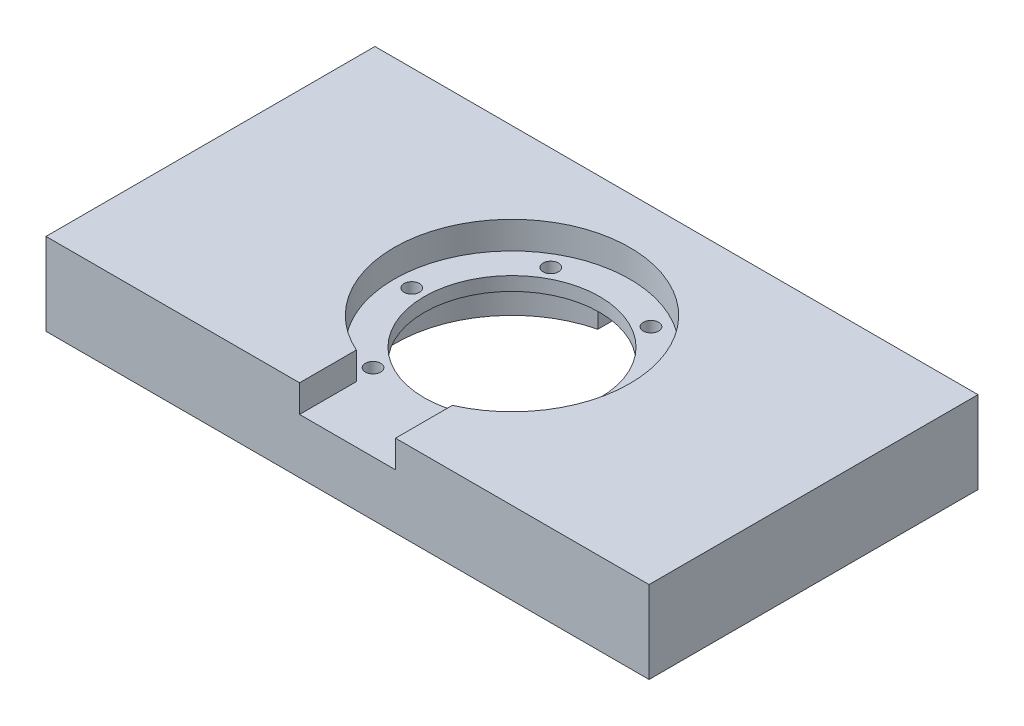
ISO-10303-21;
HEADER;
FILE_DESCRIPTION(('STEP AP214'),'2;1');
FILE_NAME('part.step','',(''),(''),'','','');
FILE_SCHEMA(('AUTOMOTIVE_DESIGN { 1 0 10303 214 1 1 1 1 }'));
ENDSEC;
DATA;
#1=APPLICATION_CONTEXT('core data for automotive mechanical design processes');
#2=APPLICATION_PROTOCOL_DEFINITION('international standard','automotive_design',2000,#1);
#3=PRODUCT_CONTEXT('',#1,'mechanical');
#4=PRODUCT('Part','Part','',(#3));
#5=PRODUCT_RELATED_PRODUCT_CATEGORY('part','',(#4));
#6=PRODUCT_DEFINITION_FORMATION('','',#4);
#7=PRODUCT_DEFINITION_CONTEXT('part definition',#1,'design');
#8=PRODUCT_DEFINITION('design','',#6,#7);
#9=PRODUCT_DEFINITION_SHAPE('','',#8);
#10=(LENGTH_UNIT() NAMED_UNIT(*) SI_UNIT(.MILLI.,.METRE.));
#11=(NAMED_UNIT(*) PLANE_ANGLE_UNIT() SI_UNIT($,.RADIAN.));
#12=(NAMED_UNIT(*) SI_UNIT($,.STERADIAN.) SOLID_ANGLE_UNIT());
#13=UNCERTAINTY_MEASURE_WITH_UNIT(LENGTH_MEASURE(1.E-05),#10,'distance_accuracy_value','');
#14=(GEOMETRIC_REPRESENTATION_CONTEXT(3) GLOBAL_UNCERTAINTY_ASSIGNED_CONTEXT((#13)) GLOBAL_UNIT_ASSIGNED_CONTEXT((#10,
#11,#12)) REPRESENTATION_CONTEXT('',''));
#15=CARTESIAN_POINT('',(0.,0.,0.));
#16=DIRECTION('',(0.,0.,1.));
#17=DIRECTION('',(1.,0.,0.));
#18=AXIS2_PLACEMENT_3D('',#15,#16,#17);
#19=CARTESIAN_POINT('',(18.1221367706661,-20.,32.2581487203663));
#20=DIRECTION('',(0.,1.,0.));
#21=DIRECTION('',(0.,0.,1.));
#22=AXIS2_PLACEMENT_3D('',#19,#20,#21);
#23=CYLINDRICAL_SURFACE('',#22,2.8);
#24=CARTESIAN_POINT('',(18.1221367706661,0.,32.2581487203663));
#25=DIRECTION('',(0.,-1.,0.));
#26=DIRECTION('',(0.,0.,-1.));
#27=AXIS2_PLACEMENT_3D('',#24,#25,#26);
#28=CIRCLE('',#27,2.8);
#29=CARTESIAN_POINT('',(18.1221367706661,0.,29.4581487203663));
#30=VERTEX_POINT('',#29);
#31=EDGE_CURVE('E225',#30,#30,#28,.T.);
#32=ORIENTED_EDGE('',*,*,#31,.F.);
#33=EDGE_LOOP('',(#32));
#34=FACE_BOUND('',#33,.T.);
#35=CARTESIAN_POINT('',(18.1221367706661,-5.,32.2581487203663));
#36=DIRECTION('',(0.,-1.,0.));
#37=DIRECTION('',(0.,0.,-1.));
#38=AXIS2_PLACEMENT_3D('',#35,#36,#37);
#39=CIRCLE('',#38,2.8);
#40=CARTESIAN_POINT('',(18.1221367706661,-5.,29.4581487203663));
#41=VERTEX_POINT('',#40);
#42=EDGE_CURVE('E303',#41,#41,#39,.T.);
#43=ORIENTED_EDGE('',*,*,#42,.T.);
#44=EDGE_LOOP('',(#43));
#45=FACE_BOUND('',#44,.T.);
#46=ADVANCED_FACE('F47',(#34,#45),#23,.F.);
#47=CARTESIAN_POINT('',(36.9974446562268,-20.,0.434843545930153));
#48=DIRECTION('',(0.,1.,0.));
#49=DIRECTION('',(0.,0.,1.));
#50=AXIS2_PLACEMENT_3D('',#47,#48,#49);
#51=CYLINDRICAL_SURFACE('',#50,2.8);
#52=CARTESIAN_POINT('',(36.9974446562268,0.,0.434843545930153));
#53=DIRECTION('',(0.,-1.,0.));
#54=DIRECTION('',(0.,0.,-1.));
#55=AXIS2_PLACEMENT_3D('',#52,#53,#54);
#56=CIRCLE('',#55,2.8);
#57=CARTESIAN_POINT('',(36.9974446562268,0.,-2.36515645406985));
#58=VERTEX_POINT('',#57);
#59=EDGE_CURVE('E221',#58,#58,#56,.T.);
#60=ORIENTED_EDGE('',*,*,#59,.F.);
#61=EDGE_LOOP('',(#60));
#62=FACE_BOUND('',#61,.T.);
#63=CARTESIAN_POINT('',(36.9974446562268,-5.,0.434843545930153));
#64=DIRECTION('',(0.,-1.,0.));
#65=DIRECTION('',(0.,0.,-1.));
#66=AXIS2_PLACEMENT_3D('',#63,#64,#65);
#67=CIRCLE('',#66,2.8);
#68=CARTESIAN_POINT('',(36.9974446562268,-5.,-2.36515645406985));
#69=VERTEX_POINT('',#68);
#70=EDGE_CURVE('E309',#69,#69,#67,.T.);
#71=ORIENTED_EDGE('',*,*,#70,.T.);
#72=EDGE_LOOP('',(#71));
#73=FACE_BOUND('',#72,.T.);
#74=ADVANCED_FACE('F351',(#62,#73),#51,.F.);
#75=CARTESIAN_POINT('',(18.8753078855607,-20.,-31.8233051744363));
#76=DIRECTION('',(0.,1.,0.));
#77=DIRECTION('',(0.,0.,1.));
#78=AXIS2_PLACEMENT_3D('',#75,#76,#77);
#79=CYLINDRICAL_SURFACE('',#78,2.8);
#80=CARTESIAN_POINT('',(18.8753078855607,0.,-31.8233051744363));
#81=DIRECTION('',(0.,-1.,0.));
#82=DIRECTION('',(0.,0.,-1.));
#83=AXIS2_PLACEMENT_3D('',#80,#81,#82);
#84=CIRCLE('',#83,2.8);
#85=CARTESIAN_POINT('',(18.8753078855607,0.,-34.6233051744363));
#86=VERTEX_POINT('',#85);
#87=EDGE_CURVE('E217',#86,#86,#84,.T.);
#88=ORIENTED_EDGE('',*,*,#87,.F.);
#89=EDGE_LOOP('',(#88));
#90=FACE_BOUND('',#89,.T.);
#91=CARTESIAN_POINT('',(18.8753078855607,-5.,-31.8233051744363));
#92=DIRECTION('',(0.,-1.,0.));
#93=DIRECTION('',(0.,0.,-1.));
#94=AXIS2_PLACEMENT_3D('',#91,#92,#93);
#95=CIRCLE('',#94,2.8);
#96=CARTESIAN_POINT('',(18.8753078855607,-5.,-34.6233051744363));
#97=VERTEX_POINT('',#96);
#98=EDGE_CURVE('E316',#97,#97,#95,.T.);
#99=ORIENTED_EDGE('',*,*,#98,.T.);
#100=EDGE_LOOP('',(#99));
#101=FACE_BOUND('',#100,.T.);
#102=ADVANCED_FACE('F358',(#90,#101),#79,.F.);
#103=CARTESIAN_POINT('',(-18.1221367706662,-20.,-32.2581487203665));
#104=DIRECTION('',(0.,1.,0.));
#105=DIRECTION('',(0.,0.,1.));
#106=AXIS2_PLACEMENT_3D('',#103,#104,#105);
#107=CYLINDRICAL_SURFACE('',#106,2.8);
#108=CARTESIAN_POINT('',(-18.1221367706662,0.,-32.2581487203665));
#109=DIRECTION('',(0.,-1.,0.));
#110=DIRECTION('',(0.,0.,-1.));
#111=AXIS2_PLACEMENT_3D('',#108,#109,#110);
#112=CIRCLE('',#111,2.8);
#113=CARTESIAN_POINT('',(-18.1221367706662,0.,-35.0581487203665));
#114=VERTEX_POINT('',#113);
#115=EDGE_CURVE('E213',#114,#114,#112,.T.);
#116=ORIENTED_EDGE('',*,*,#115,.F.);
#117=EDGE_LOOP('',(#116));
#118=FACE_BOUND('',#117,.T.);
#119=CARTESIAN_POINT('',(-18.1221367706662,-5.,-32.2581487203665));
#120=DIRECTION('',(0.,-1.,0.));
#121=DIRECTION('',(0.,0.,-1.));
#122=AXIS2_PLACEMENT_3D('',#119,#120,#121);
#123=CIRCLE('',#122,2.8);
#124=CARTESIAN_POINT('',(-18.1221367706662,-5.,-35.0581487203665));
#125=VERTEX_POINT('',#124);
#126=EDGE_CURVE('E320',#125,#125,#123,.T.);
#127=ORIENTED_EDGE('',*,*,#126,.T.);
#128=EDGE_LOOP('',(#127));
#129=FACE_BOUND('',#128,.T.);
#130=ADVANCED_FACE('F518',(#118,#129),#107,.F.);
#131=CARTESIAN_POINT('',(-36.9974446562269,-20.,-0.434843545930336));
#132=DIRECTION('',(0.,1.,0.));
#133=DIRECTION('',(0.,0.,1.));
#134=AXIS2_PLACEMENT_3D('',#131,#132,#133);
#135=CYLINDRICAL_SURFACE('',#134,2.8);
#136=CARTESIAN_POINT('',(-36.9974446562269,0.,-0.434843545930336));
#137=DIRECTION('',(0.,-1.,0.));
#138=DIRECTION('',(0.,0.,-1.));
#139=AXIS2_PLACEMENT_3D('',#136,#137,#138);
#140=CIRCLE('',#139,2.8);
#141=CARTESIAN_POINT('',(-36.9974446562269,0.,-3.23484354593033));
#142=VERTEX_POINT('',#141);
#143=EDGE_CURVE('E209',#142,#142,#140,.T.);
#144=ORIENTED_EDGE('',*,*,#143,.F.);
#145=EDGE_LOOP('',(#144));
#146=FACE_BOUND('',#145,.T.);
#147=CARTESIAN_POINT('',(-36.9974446562269,-5.,-0.434843545930336));
#148=DIRECTION('',(0.,-1.,0.));
#149=DIRECTION('',(0.,0.,-1.));
#150=AXIS2_PLACEMENT_3D('',#147,#148,#149);
#151=CIRCLE('',#150,2.8);
#152=CARTESIAN_POINT('',(-36.9974446562269,-5.,-3.23484354593033));
#153=VERTEX_POINT('',#152);
#154=EDGE_CURVE('E324',#153,#153,#151,.T.);
#155=ORIENTED_EDGE('',*,*,#154,.T.);
#156=EDGE_LOOP('',(#155));
#157=FACE_BOUND('',#156,.T.);
#158=ADVANCED_FACE('F526',(#146,#157),#135,.F.);
#159=CARTESIAN_POINT('',(-18.8753078855608,-20.,31.8233051744361));
#160=DIRECTION('',(0.,1.,0.));
#161=DIRECTION('',(0.,0.,1.));
#162=AXIS2_PLACEMENT_3D('',#159,#160,#161);
#163=CYLINDRICAL_SURFACE('',#162,2.8);
#164=CARTESIAN_POINT('',(-18.8753078855608,0.,31.8233051744361));
#165=DIRECTION('',(0.,-1.,0.));
#166=DIRECTION('',(0.,0.,-1.));
#167=AXIS2_PLACEMENT_3D('',#164,#165,#166);
#168=CIRCLE('',#167,2.8);
#169=CARTESIAN_POINT('',(-18.8753078855608,0.,29.0233051744361));
#170=VERTEX_POINT('',#169);
#171=EDGE_CURVE('E196',#170,#170,#168,.T.);
#172=ORIENTED_EDGE('',*,*,#171,.F.);
#173=EDGE_LOOP('',(#172));
#174=FACE_BOUND('',#173,.T.);
#175=CARTESIAN_POINT('',(-18.8753078855608,-5.,31.8233051744361));
#176=DIRECTION('',(0.,-1.,0.));
#177=DIRECTION('',(0.,0.,-1.));
#178=AXIS2_PLACEMENT_3D('',#175,#176,#177);
#179=CIRCLE('',#178,2.8);
#180=CARTESIAN_POINT('',(-18.8753078855608,-5.,29.0233051744361));
#181=VERTEX_POINT('',#180);
#182=EDGE_CURVE('E328',#181,#181,#179,.T.);
#183=ORIENTED_EDGE('',*,*,#182,.T.);
#184=EDGE_LOOP('',(#183));
#185=FACE_BOUND('',#184,.T.);
#186=ADVANCED_FACE('F535',(#174,#185),#163,.F.);
#187=CARTESIAN_POINT('',(0.,-20.,0.));
#188=DIRECTION('',(0.,1.,0.));
#189=DIRECTION('',(0.,0.,1.));
#190=AXIS2_PLACEMENT_3D('',#187,#188,#189);
#191=CYLINDRICAL_SURFACE('',#190,32.);
#192=CARTESIAN_POINT('',(0.,0.,0.));
#193=DIRECTION('',(0.,1.,0.));
#194=DIRECTION('',(0.,0.,1.));
#195=AXIS2_PLACEMENT_3D('',#192,#193,#194);
#196=CIRCLE('',#195,32.);
#197=CARTESIAN_POINT('',(0.,0.,32.));
#198=VERTEX_POINT('',#197);
#199=EDGE_CURVE('E164',#198,#198,#196,.T.);
#200=ORIENTED_EDGE('',*,*,#199,.T.);
#201=EDGE_LOOP('',(#200));
#202=FACE_BOUND('',#201,.T.);
#203=CARTESIAN_POINT('',(0.,-5.,0.));
#204=DIRECTION('',(0.,-1.,0.));
#205=DIRECTION('',(0.,0.,-1.));
#206=AXIS2_PLACEMENT_3D('',#203,#204,#205);
#207=CIRCLE('',#206,32.);
#208=CARTESIAN_POINT('',(0.,-5.,-32.));
#209=VERTEX_POINT('',#208);
#210=EDGE_CURVE('E51',#209,#209,#207,.F.);
#211=ORIENTED_EDGE('',*,*,#210,.F.);
#212=EDGE_LOOP('',(#211));
#213=FACE_BOUND('',#212,.T.);
#214=ADVANCED_FACE('F379',(#202,#213),#191,.F.);
#215=CARTESIAN_POINT('',(0.,10.,0.));
#216=DIRECTION('',(0.,1.,0.));
#217=DIRECTION('',(0.,0.,1.));
#218=AXIS2_PLACEMENT_3D('',#215,#216,#217);
#219=PLANE('',#218);
#220=DIRECTION('',(0.,0.,1.));
#221=VECTOR('',#220,1.);
#222=CARTESIAN_POINT('',(-17.5,10.,-60.001));
#223=LINE('',#222,#221);
#224=CARTESIAN_POINT('',(-17.5,10.,39.2778563569857));
#225=VERTEX_POINT('',#224);
#226=CARTESIAN_POINT('',(-17.5,10.,60.));
#227=VERTEX_POINT('',#226);
#228=EDGE_CURVE('E200',#225,#227,#223,.T.);
#229=ORIENTED_EDGE('',*,*,#228,.F.);
#230=CARTESIAN_POINT('',(0.,10.,0.));
#231=DIRECTION('',(0.,1.,0.));
#232=DIRECTION('',(0.,0.,1.));
#233=AXIS2_PLACEMENT_3D('',#230,#231,#232);
#234=CIRCLE('',#233,43.);
#235=CARTESIAN_POINT('',(17.5,10.,39.2778563569857));
#236=VERTEX_POINT('',#235);
#237=EDGE_CURVE('E246',#236,#225,#234,.T.);
#238=ORIENTED_EDGE('',*,*,#237,.F.);
#239=DIRECTION('',(0.,0.,1.));
#240=VECTOR('',#239,1.);
#241=CARTESIAN_POINT('',(17.5,10.,-60.001));
#242=LINE('',#241,#240);
#243=CARTESIAN_POINT('',(17.5,10.,60.));
#244=VERTEX_POINT('',#243);
#245=EDGE_CURVE('E193',#236,#244,#242,.T.);
#246=ORIENTED_EDGE('',*,*,#245,.T.);
#247=DIRECTION('',(1.,0.,0.));
#248=VECTOR('',#247,1.);
#249=CARTESIAN_POINT('',(110.,10.,60.));
#250=LINE('',#249,#248);
#251=CARTESIAN_POINT('',(110.,10.,60.));
#252=VERTEX_POINT('',#251);
#253=EDGE_CURVE('E256',#244,#252,#250,.T.);
#254=ORIENTED_EDGE('',*,*,#253,.T.);
#255=DIRECTION('',(0.,0.,-1.));
#256=VECTOR('',#255,1.);
#257=CARTESIAN_POINT('',(110.,10.,60.));
#258=LINE('',#257,#256);
#259=CARTESIAN_POINT('',(110.,10.,-60.));
#260=VERTEX_POINT('',#259);
#261=EDGE_CURVE('E261',#252,#260,#258,.T.);
#262=ORIENTED_EDGE('',*,*,#261,.T.);
#263=DIRECTION('',(-1.,0.,0.));
#264=VECTOR('',#263,1.);
#265=CARTESIAN_POINT('',(110.,10.,-60.));
#266=LINE('',#265,#264);
#267=CARTESIAN_POINT('',(-110.,10.,-60.));
#268=VERTEX_POINT('',#267);
#269=EDGE_CURVE('E264',#260,#268,#266,.T.);
#270=ORIENTED_EDGE('',*,*,#269,.T.);
#271=DIRECTION('',(0.,0.,1.));
#272=VECTOR('',#271,1.);
#273=CARTESIAN_POINT('',(-110.,10.,60.));
#274=LINE('',#273,#272);
#275=CARTESIAN_POINT('',(-110.,10.,60.));
#276=VERTEX_POINT('',#275);
#277=EDGE_CURVE('E250',#268,#276,#274,.T.);
#278=ORIENTED_EDGE('',*,*,#277,.T.);
#279=EDGE_CURVE('E257',#276,#227,#250,.T.);
#280=ORIENTED_EDGE('',*,*,#279,.T.);
#281=EDGE_LOOP('',(#229,#238,#246,#254,#262,#270,#278,#280));
#282=FACE_BOUND('',#281,.T.);
#283=ADVANCED_FACE('F376',(#282),#219,.T.);
#284=CARTESIAN_POINT('',(-110.,10.,60.));
#285=DIRECTION('',(1.,0.,0.));
#286=DIRECTION('',(0.,0.,-1.));
#287=AXIS2_PLACEMENT_3D('',#284,#285,#286);
#288=PLANE('',#287);
#289=DIRECTION('',(0.,-1.,0.));
#290=VECTOR('',#289,1.);
#291=CARTESIAN_POINT('',(-110.,10.,-60.));
#292=LINE('',#291,#290);
#293=CARTESIAN_POINT('',(-110.,-20.,-60.));
#294=VERTEX_POINT('',#293);
#295=EDGE_CURVE('E267',#268,#294,#292,.T.);
#296=ORIENTED_EDGE('',*,*,#295,.T.);
#297=DIRECTION('',(0.,0.,-1.));
#298=VECTOR('',#297,1.);
#299=CARTESIAN_POINT('',(-110.,-20.,60.));
#300=LINE('',#299,#298);
#301=CARTESIAN_POINT('',(-110.,-20.,60.));
#302=VERTEX_POINT('',#301);
#303=EDGE_CURVE('E229',#302,#294,#300,.T.);
#304=ORIENTED_EDGE('',*,*,#303,.F.);
#305=DIRECTION('',(0.,-1.,0.));
#306=VECTOR('',#305,1.);
#307=CARTESIAN_POINT('',(-110.,10.,60.));
#308=LINE('',#307,#306);
#309=EDGE_CURVE('E57',#276,#302,#308,.T.);
#310=ORIENTED_EDGE('',*,*,#309,.F.);
#311=ORIENTED_EDGE('',*,*,#277,.F.);
#312=EDGE_LOOP('',(#296,#304,#310,#311));
#313=FACE_BOUND('',#312,.T.);
#314=ADVANCED_FACE('F49',(#313),#288,.F.);
#315=CARTESIAN_POINT('',(110.,10.,60.));
#316=DIRECTION('',(0.,0.,-1.));
#317=DIRECTION('',(-1.,0.,0.));
#318=AXIS2_PLACEMENT_3D('',#315,#316,#317);
#319=PLANE('',#318);
#320=DIRECTION('',(1.,0.,0.));
#321=VECTOR('',#320,1.);
#322=CARTESIAN_POINT('',(-17.5,0.,60.));
#323=LINE('',#322,#321);
#324=CARTESIAN_POINT('',(-17.5,0.,60.));
#325=VERTEX_POINT('',#324);
#326=CARTESIAN_POINT('',(17.5,0.,60.));
#327=VERTEX_POINT('',#326);
#328=EDGE_CURVE('E190',#325,#327,#323,.T.);
#329=ORIENTED_EDGE('',*,*,#328,.F.);
#330=DIRECTION('',(0.,-1.,0.));
#331=VECTOR('',#330,1.);
#332=CARTESIAN_POINT('',(-17.5,0.,60.));
#333=LINE('',#332,#331);
#334=EDGE_CURVE('E186',#227,#325,#333,.T.);
#335=ORIENTED_EDGE('',*,*,#334,.F.);
#336=ORIENTED_EDGE('',*,*,#279,.F.);
#337=ORIENTED_EDGE('',*,*,#309,.T.);
#338=DIRECTION('',(-1.,0.,0.));
#339=VECTOR('',#338,1.);
#340=CARTESIAN_POINT('',(-110.,-20.,60.));
#341=LINE('',#340,#339);
#342=CARTESIAN_POINT('',(110.,-20.,60.));
#343=VERTEX_POINT('',#342);
#344=EDGE_CURVE('E241',#343,#302,#341,.T.);
#345=ORIENTED_EDGE('',*,*,#344,.F.);
#346=DIRECTION('',(0.,-1.,0.));
#347=VECTOR('',#346,1.);
#348=CARTESIAN_POINT('',(110.,10.,60.));
#349=LINE('',#348,#347);
#350=EDGE_CURVE('E274',#252,#343,#349,.T.);
#351=ORIENTED_EDGE('',*,*,#350,.F.);
#352=ORIENTED_EDGE('',*,*,#253,.F.);
#353=DIRECTION('',(0.,1.,0.));
#354=VECTOR('',#353,1.);
#355=CARTESIAN_POINT('',(17.5,0.,60.));
#356=LINE('',#355,#354);
#357=EDGE_CURVE('E183',#327,#244,#356,.T.);
#358=ORIENTED_EDGE('',*,*,#357,.F.);
#359=EDGE_LOOP('',(#329,#335,#336,#337,#345,#351,#352,#358));
#360=FACE_BOUND('',#359,.T.);
#361=ADVANCED_FACE('F282',(#360),#319,.F.);
#362=CARTESIAN_POINT('',(110.,10.,60.));
#363=DIRECTION('',(-1.,0.,0.));
#364=DIRECTION('',(0.,0.,1.));
#365=AXIS2_PLACEMENT_3D('',#362,#363,#364);
#366=PLANE('',#365);
#367=ORIENTED_EDGE('',*,*,#350,.T.);
#368=DIRECTION('',(0.,0.,1.));
#369=VECTOR('',#368,1.);
#370=CARTESIAN_POINT('',(110.,-20.,60.));
#371=LINE('',#370,#369);
#372=CARTESIAN_POINT('',(110.,-20.,-60.));
#373=VERTEX_POINT('',#372);
#374=EDGE_CURVE('E237',#373,#343,#371,.T.);
#375=ORIENTED_EDGE('',*,*,#374,.F.);
#376=DIRECTION('',(0.,-1.,0.));
#377=VECTOR('',#376,1.);
#378=CARTESIAN_POINT('',(110.,10.,-60.));
#379=LINE('',#378,#377);
#380=EDGE_CURVE('E270',#260,#373,#379,.T.);
#381=ORIENTED_EDGE('',*,*,#380,.F.);
#382=ORIENTED_EDGE('',*,*,#261,.F.);
#383=EDGE_LOOP('',(#367,#375,#381,#382));
#384=FACE_BOUND('',#383,.T.);
#385=ADVANCED_FACE('F382',(#384),#366,.F.);
#386=CARTESIAN_POINT('',(110.,10.,-60.));
#387=DIRECTION('',(0.,0.,1.));
#388=DIRECTION('',(1.,0.,0.));
#389=AXIS2_PLACEMENT_3D('',#386,#387,#388);
#390=PLANE('',#389);
#391=DIRECTION('',(1.,0.,0.));
#392=VECTOR('',#391,1.);
#393=CARTESIAN_POINT('',(9.99999999999999,-10.,-60.));
#394=LINE('',#393,#392);
#395=CARTESIAN_POINT('',(-10.,-10.,-60.));
#396=VERTEX_POINT('',#395);
#397=CARTESIAN_POINT('',(9.99999999999999,-10.,-60.));
#398=VERTEX_POINT('',#397);
#399=EDGE_CURVE('E299',#396,#398,#394,.T.);
#400=ORIENTED_EDGE('',*,*,#399,.F.);
#401=DIRECTION('',(0.,1.,0.));
#402=VECTOR('',#401,1.);
#403=CARTESIAN_POINT('',(-10.,-10.,-60.));
#404=LINE('',#403,#402);
#405=CARTESIAN_POINT('',(-10.,-20.,-60.));
#406=VERTEX_POINT('',#405);
#407=EDGE_CURVE('E297',#406,#396,#404,.T.);
#408=ORIENTED_EDGE('',*,*,#407,.F.);
#409=DIRECTION('',(1.,0.,0.));
#410=VECTOR('',#409,1.);
#411=CARTESIAN_POINT('',(-110.,-20.,-60.));
#412=LINE('',#411,#410);
#413=EDGE_CURVE('E234',#294,#406,#412,.T.);
#414=ORIENTED_EDGE('',*,*,#413,.F.);
#415=ORIENTED_EDGE('',*,*,#295,.F.);
#416=ORIENTED_EDGE('',*,*,#269,.F.);
#417=ORIENTED_EDGE('',*,*,#380,.T.);
#418=CARTESIAN_POINT('',(9.99999999999999,-20.,-60.));
#419=VERTEX_POINT('',#418);
#420=EDGE_CURVE('E233',#419,#373,#412,.T.);
#421=ORIENTED_EDGE('',*,*,#420,.F.);
#422=DIRECTION('',(0.,-1.,0.));
#423=VECTOR('',#422,1.);
#424=CARTESIAN_POINT('',(9.99999999999999,-10.,-60.));
#425=LINE('',#424,#423);
#426=EDGE_CURVE('E157',#398,#419,#425,.T.);
#427=ORIENTED_EDGE('',*,*,#426,.F.);
#428=EDGE_LOOP('',(#400,#408,#414,#415,#416,#417,#421,#427));
#429=FACE_BOUND('',#428,.T.);
#430=ADVANCED_FACE('F295',(#429),#390,.F.);
#431=CARTESIAN_POINT('',(0.,10.,0.));
#432=DIRECTION('',(0.,-1.,0.));
#433=DIRECTION('',(0.,0.,-1.));
#434=AXIS2_PLACEMENT_3D('',#431,#432,#433);
#435=CYLINDRICAL_SURFACE('',#434,43.);
#436=DIRECTION('',(0.,-1.,0.));
#437=VECTOR('',#436,1.);
#438=CARTESIAN_POINT('',(-17.5,10.,39.2778563569857));
#439=LINE('',#438,#437);
#440=CARTESIAN_POINT('',(-17.5,0.,39.2778563569857));
#441=VERTEX_POINT('',#440);
#442=EDGE_CURVE('E175',#225,#441,#439,.T.);
#443=ORIENTED_EDGE('',*,*,#442,.T.);
#444=CARTESIAN_POINT('',(0.,0.,0.));
#445=DIRECTION('',(0.,1.,0.));
#446=DIRECTION('',(0.,0.,1.));
#447=AXIS2_PLACEMENT_3D('',#444,#445,#446);
#448=CIRCLE('',#447,43.);
#449=CARTESIAN_POINT('',(17.5,0.,39.2778563569857));
#450=VERTEX_POINT('',#449);
#451=EDGE_CURVE('E245',#450,#441,#448,.T.);
#452=ORIENTED_EDGE('',*,*,#451,.F.);
#453=DIRECTION('',(0.,-1.,0.));
#454=VECTOR('',#453,1.);
#455=CARTESIAN_POINT('',(17.5,10.,39.2778563569857));
#456=LINE('',#455,#454);
#457=EDGE_CURVE('E179',#450,#236,#456,.F.);
#458=ORIENTED_EDGE('',*,*,#457,.T.);
#459=ORIENTED_EDGE('',*,*,#237,.T.);
#460=EDGE_LOOP('',(#443,#452,#458,#459));
#461=FACE_BOUND('',#460,.T.);
#462=ADVANCED_FACE('F371',(#461),#435,.F.);
#463=CARTESIAN_POINT('',(0.,0.,0.));
#464=DIRECTION('',(0.,-1.,0.));
#465=DIRECTION('',(0.,0.,-1.));
#466=AXIS2_PLACEMENT_3D('',#463,#464,#465);
#467=PLANE('',#466);
#468=ORIENTED_EDGE('',*,*,#199,.F.);
#469=EDGE_LOOP('',(#468));
#470=FACE_BOUND('',#469,.T.);
#471=ORIENTED_EDGE('',*,*,#171,.T.);
#472=EDGE_LOOP('',(#471));
#473=FACE_BOUND('',#472,.T.);
#474=ORIENTED_EDGE('',*,*,#143,.T.);
#475=EDGE_LOOP('',(#474));
#476=FACE_BOUND('',#475,.T.);
#477=ORIENTED_EDGE('',*,*,#115,.T.);
#478=EDGE_LOOP('',(#477));
#479=FACE_BOUND('',#478,.T.);
#480=ORIENTED_EDGE('',*,*,#87,.T.);
#481=EDGE_LOOP('',(#480));
#482=FACE_BOUND('',#481,.T.);
#483=ORIENTED_EDGE('',*,*,#59,.T.);
#484=EDGE_LOOP('',(#483));
#485=FACE_BOUND('',#484,.T.);
#486=ORIENTED_EDGE('',*,*,#31,.T.);
#487=EDGE_LOOP('',(#486));
#488=FACE_BOUND('',#487,.T.);
#489=ORIENTED_EDGE('',*,*,#451,.T.);
#490=DIRECTION('',(0.,0.,1.));
#491=VECTOR('',#490,1.);
#492=CARTESIAN_POINT('',(-17.5,0.,-60.001));
#493=LINE('',#492,#491);
#494=EDGE_CURVE('E197',#441,#325,#493,.T.);
#495=ORIENTED_EDGE('',*,*,#494,.T.);
#496=ORIENTED_EDGE('',*,*,#328,.T.);
#497=DIRECTION('',(0.,0.,1.));
#498=VECTOR('',#497,1.);
#499=CARTESIAN_POINT('',(17.5,0.,-60.001));
#500=LINE('',#499,#498);
#501=EDGE_CURVE('E71',#450,#327,#500,.T.);
#502=ORIENTED_EDGE('',*,*,#501,.F.);
#503=EDGE_LOOP('',(#489,#495,#496,#502));
#504=FACE_BOUND('',#503,.T.);
#505=ADVANCED_FACE('F368',(#470,#473,#476,#479,#482,#485,#488,#504),#467,.F.);
#506=CARTESIAN_POINT('',(0.,-20.,0.));
#507=DIRECTION('',(0.,-1.,0.));
#508=DIRECTION('',(0.,0.,-1.));
#509=AXIS2_PLACEMENT_3D('',#506,#507,#508);
#510=PLANE('',#509);
#511=CARTESIAN_POINT('',(0.,-20.,0.));
#512=DIRECTION('',(0.,-1.,0.));
#513=DIRECTION('',(0.,0.,-1.));
#514=AXIS2_PLACEMENT_3D('',#511,#512,#513);
#515=CIRCLE('',#514,42.5);
#516=CARTESIAN_POINT('',(10.,-20.,-41.3067791046458));
#517=VERTEX_POINT('',#516);
#518=CARTESIAN_POINT('',(-10.,-20.,-41.3067791046458));
#519=VERTEX_POINT('',#518);
#520=EDGE_CURVE('E139',#517,#519,#515,.T.);
#521=ORIENTED_EDGE('',*,*,#520,.F.);
#522=DIRECTION('',(0.,0.,-1.));
#523=VECTOR('',#522,1.);
#524=CARTESIAN_POINT('',(10.,-20.,60.001));
#525=LINE('',#524,#523);
#526=EDGE_CURVE('E149',#517,#419,#525,.T.);
#527=ORIENTED_EDGE('',*,*,#526,.T.);
#528=ORIENTED_EDGE('',*,*,#420,.T.);
#529=ORIENTED_EDGE('',*,*,#374,.T.);
#530=ORIENTED_EDGE('',*,*,#344,.T.);
#531=ORIENTED_EDGE('',*,*,#303,.T.);
#532=ORIENTED_EDGE('',*,*,#413,.T.);
#533=DIRECTION('',(0.,0.,-1.));
#534=VECTOR('',#533,1.);
#535=CARTESIAN_POINT('',(-9.99999999999999,-20.,60.001));
#536=LINE('',#535,#534);
#537=EDGE_CURVE('E152',#519,#406,#536,.T.);
#538=ORIENTED_EDGE('',*,*,#537,.F.);
#539=EDGE_LOOP('',(#521,#527,#528,#529,#530,#531,#532,#538));
#540=FACE_BOUND('',#539,.T.);
#541=ADVANCED_FACE('F148',(#540),#510,.T.);
#542=CARTESIAN_POINT('',(-17.5,0.,-60.001));
#543=DIRECTION('',(-1.,0.,0.));
#544=DIRECTION('',(0.,0.,1.));
#545=AXIS2_PLACEMENT_3D('',#542,#543,#544);
#546=PLANE('',#545);
#547=ORIENTED_EDGE('',*,*,#228,.T.);
#548=ORIENTED_EDGE('',*,*,#334,.T.);
#549=ORIENTED_EDGE('',*,*,#494,.F.);
#550=ORIENTED_EDGE('',*,*,#442,.F.);
#551=EDGE_LOOP('',(#547,#548,#549,#550));
#552=FACE_BOUND('',#551,.T.);
#553=ADVANCED_FACE('F367',(#552),#546,.F.);
#554=CARTESIAN_POINT('',(17.5,0.,-60.001));
#555=DIRECTION('',(1.,0.,0.));
#556=DIRECTION('',(0.,0.,-1.));
#557=AXIS2_PLACEMENT_3D('',#554,#555,#556);
#558=PLANE('',#557);
#559=ORIENTED_EDGE('',*,*,#501,.T.);
#560=ORIENTED_EDGE('',*,*,#357,.T.);
#561=ORIENTED_EDGE('',*,*,#245,.F.);
#562=ORIENTED_EDGE('',*,*,#457,.F.);
#563=EDGE_LOOP('',(#559,#560,#561,#562));
#564=FACE_BOUND('',#563,.T.);
#565=ADVANCED_FACE('F440',(#564),#558,.F.);
#566=CARTESIAN_POINT('',(-9.99999999999999,-10.,60.001));
#567=DIRECTION('',(-1.,0.,0.));
#568=DIRECTION('',(0.,-1.,0.));
#569=AXIS2_PLACEMENT_3D('',#566,#567,#568);
#570=PLANE('',#569);
#571=DIRECTION('',(0.,0.,-1.));
#572=VECTOR('',#571,1.);
#573=CARTESIAN_POINT('',(-9.99999999999999,-10.,60.001));
#574=LINE('',#573,#572);
#575=CARTESIAN_POINT('',(-10.,-10.,-41.3067791046458));
#576=VERTEX_POINT('',#575);
#577=EDGE_CURVE('E166',#576,#396,#574,.T.);
#578=ORIENTED_EDGE('',*,*,#577,.F.);
#579=DIRECTION('',(0.,-1.,0.));
#580=VECTOR('',#579,1.);
#581=CARTESIAN_POINT('',(-10.,-5.,-41.3067791046458));
#582=LINE('',#581,#580);
#583=EDGE_CURVE('E64',#576,#519,#582,.T.);
#584=ORIENTED_EDGE('',*,*,#583,.T.);
#585=ORIENTED_EDGE('',*,*,#537,.T.);
#586=ORIENTED_EDGE('',*,*,#407,.T.);
#587=EDGE_LOOP('',(#578,#584,#585,#586));
#588=FACE_BOUND('',#587,.T.);
#589=ADVANCED_FACE('F449',(#588),#570,.F.);
#590=CARTESIAN_POINT('',(10.,-10.,60.001));
#591=DIRECTION('',(1.,0.,0.));
#592=DIRECTION('',(0.,1.,0.));
#593=AXIS2_PLACEMENT_3D('',#590,#591,#592);
#594=PLANE('',#593);
#595=ORIENTED_EDGE('',*,*,#526,.F.);
#596=DIRECTION('',(0.,-1.,0.));
#597=VECTOR('',#596,1.);
#598=CARTESIAN_POINT('',(9.99999999999999,-5.,-41.3067791046458));
#599=LINE('',#598,#597);
#600=CARTESIAN_POINT('',(9.99999999999999,-10.,-41.3067791046458));
#601=VERTEX_POINT('',#600);
#602=EDGE_CURVE('E136',#517,#601,#599,.F.);
#603=ORIENTED_EDGE('',*,*,#602,.T.);
#604=DIRECTION('',(0.,0.,-1.));
#605=VECTOR('',#604,1.);
#606=CARTESIAN_POINT('',(10.,-10.,60.001));
#607=LINE('',#606,#605);
#608=EDGE_CURVE('E160',#601,#398,#607,.T.);
#609=ORIENTED_EDGE('',*,*,#608,.T.);
#610=ORIENTED_EDGE('',*,*,#426,.T.);
#611=EDGE_LOOP('',(#595,#603,#609,#610));
#612=FACE_BOUND('',#611,.T.);
#613=ADVANCED_FACE('F155',(#612),#594,.F.);
#614=CARTESIAN_POINT('',(10.,-10.,60.001));
#615=DIRECTION('',(0.,1.,0.));
#616=DIRECTION('',(0.,0.,1.));
#617=AXIS2_PLACEMENT_3D('',#614,#615,#616);
#618=PLANE('',#617);
#619=ORIENTED_EDGE('',*,*,#608,.F.);
#620=CARTESIAN_POINT('',(0.,-10.,0.));
#621=DIRECTION('',(0.,1.,0.));
#622=DIRECTION('',(0.,0.,1.));
#623=AXIS2_PLACEMENT_3D('',#620,#621,#622);
#624=CIRCLE('',#623,42.5);
#625=EDGE_CURVE('E11',#601,#576,#624,.T.);
#626=ORIENTED_EDGE('',*,*,#625,.T.);
#627=ORIENTED_EDGE('',*,*,#577,.T.);
#628=ORIENTED_EDGE('',*,*,#399,.T.);
#629=EDGE_LOOP('',(#619,#626,#627,#628));
#630=FACE_BOUND('',#629,.T.);
#631=ADVANCED_FACE('F346',(#630),#618,.F.);
#632=CARTESIAN_POINT('',(0.,-5.,0.));
#633=DIRECTION('',(0.,-1.,0.));
#634=DIRECTION('',(0.,0.,-1.));
#635=AXIS2_PLACEMENT_3D('',#632,#633,#634);
#636=PLANE('',#635);
#637=ORIENTED_EDGE('',*,*,#42,.F.);
#638=EDGE_LOOP('',(#637));
#639=FACE_BOUND('',#638,.T.);
#640=ORIENTED_EDGE('',*,*,#70,.F.);
#641=EDGE_LOOP('',(#640));
#642=FACE_BOUND('',#641,.T.);
#643=ORIENTED_EDGE('',*,*,#98,.F.);
#644=EDGE_LOOP('',(#643));
#645=FACE_BOUND('',#644,.T.);
#646=ORIENTED_EDGE('',*,*,#126,.F.);
#647=EDGE_LOOP('',(#646));
#648=FACE_BOUND('',#647,.T.);
#649=ORIENTED_EDGE('',*,*,#154,.F.);
#650=EDGE_LOOP('',(#649));
#651=FACE_BOUND('',#650,.T.);
#652=ORIENTED_EDGE('',*,*,#182,.F.);
#653=EDGE_LOOP('',(#652));
#654=FACE_BOUND('',#653,.T.);
#655=CARTESIAN_POINT('',(0.,-5.,0.));
#656=DIRECTION('',(0.,-1.,0.));
#657=DIRECTION('',(0.,0.,-1.));
#658=AXIS2_PLACEMENT_3D('',#655,#656,#657);
#659=CIRCLE('',#658,42.5);
#660=CARTESIAN_POINT('',(0.,-5.,-42.5));
#661=VERTEX_POINT('',#660);
#662=EDGE_CURVE('E144',#661,#661,#659,.T.);
#663=ORIENTED_EDGE('',*,*,#662,.T.);
#664=EDGE_LOOP('',(#663));
#665=FACE_BOUND('',#664,.T.);
#666=ORIENTED_EDGE('',*,*,#210,.T.);
#667=EDGE_LOOP('',(#666));
#668=FACE_BOUND('',#667,.T.);
#669=ADVANCED_FACE('F338',(#639,#642,#645,#648,#651,#654,#665,#668),#636,.T.);
#670=CARTESIAN_POINT('',(0.,-5.,0.));
#671=DIRECTION('',(0.,-1.,0.));
#672=DIRECTION('',(0.,0.,-1.));
#673=AXIS2_PLACEMENT_3D('',#670,#671,#672);
#674=CYLINDRICAL_SURFACE('',#673,42.5);
#675=ORIENTED_EDGE('',*,*,#662,.F.);
#676=EDGE_LOOP('',(#675));
#677=FACE_BOUND('',#676,.T.);
#678=ORIENTED_EDGE('',*,*,#625,.F.);
#679=ORIENTED_EDGE('',*,*,#602,.F.);
#680=ORIENTED_EDGE('',*,*,#520,.T.);
#681=ORIENTED_EDGE('',*,*,#583,.F.);
#682=EDGE_LOOP('',(#678,#679,#680,#681));
#683=FACE_BOUND('',#682,.T.);
#684=ADVANCED_FACE('F138',(#677,#683),#674,.F.);
#685=CLOSED_SHELL('',(#46,#74,#102,#130,#158,#186,#214,#283,#314,#361,#385,#430,#462,#505,#541,
#553,#565,#589,#613,#631,#669,#684));
#686=MANIFOLD_SOLID_BREP('B2',#685);
#687=ADVANCED_BREP_SHAPE_REPRESENTATION('',(#18,#686),#14);
#688=SHAPE_DEFINITION_REPRESENTATION(#9,#687);
ENDSEC;
END-ISO-10303-21;
